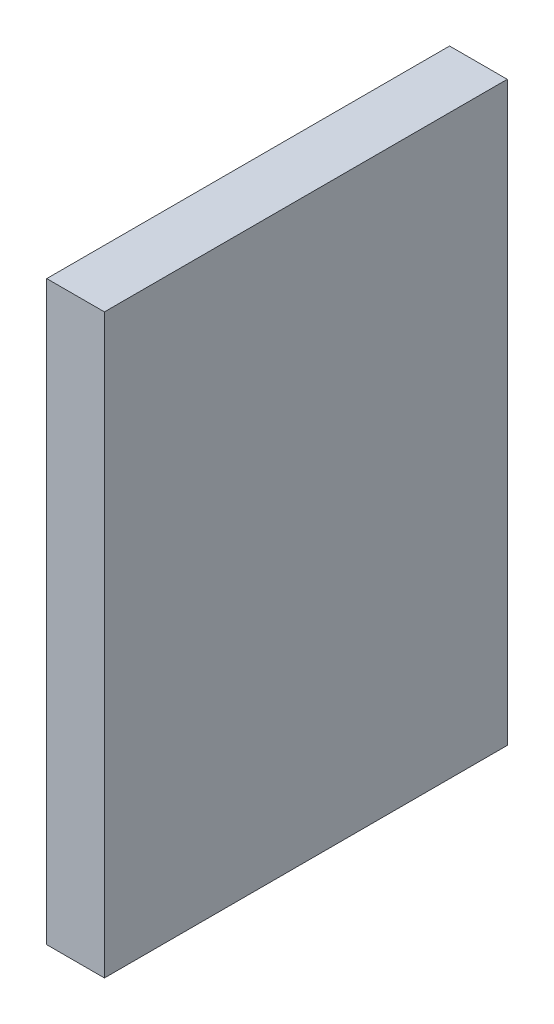
ISO-10303-21;
HEADER;
FILE_DESCRIPTION(('STEP AP214'),'2;1');
FILE_NAME('part.step','',(''),(''),'','','');
FILE_SCHEMA(('AUTOMOTIVE_DESIGN { 1 0 10303 214 1 1 1 1 }'));
ENDSEC;
DATA;
#1=APPLICATION_CONTEXT('core data for automotive mechanical design processes');
#2=APPLICATION_PROTOCOL_DEFINITION('international standard','automotive_design',2000,#1);
#3=PRODUCT_CONTEXT('',#1,'mechanical');
#4=PRODUCT('Part','Part','',(#3));
#5=PRODUCT_RELATED_PRODUCT_CATEGORY('part','',(#4));
#6=PRODUCT_DEFINITION_FORMATION('','',#4);
#7=PRODUCT_DEFINITION_CONTEXT('part definition',#1,'design');
#8=PRODUCT_DEFINITION('design','',#6,#7);
#9=PRODUCT_DEFINITION_SHAPE('','',#8);
#10=(LENGTH_UNIT() NAMED_UNIT(*) SI_UNIT(.MILLI.,.METRE.));
#11=(NAMED_UNIT(*) PLANE_ANGLE_UNIT() SI_UNIT($,.RADIAN.));
#12=(NAMED_UNIT(*) SI_UNIT($,.STERADIAN.) SOLID_ANGLE_UNIT());
#13=UNCERTAINTY_MEASURE_WITH_UNIT(LENGTH_MEASURE(1.E-05),#10,'distance_accuracy_value','');
#14=(GEOMETRIC_REPRESENTATION_CONTEXT(3) GLOBAL_UNCERTAINTY_ASSIGNED_CONTEXT((#13)) GLOBAL_UNIT_ASSIGNED_CONTEXT((#10,
#11,#12)) REPRESENTATION_CONTEXT('',''));
#15=CARTESIAN_POINT('',(0.,0.,0.));
#16=DIRECTION('',(0.,0.,1.));
#17=DIRECTION('',(1.,0.,0.));
#18=AXIS2_PLACEMENT_3D('',#15,#16,#17);
#19=CARTESIAN_POINT('',(3.,0.,0.));
#20=DIRECTION('',(0.,0.,-1.));
#21=DIRECTION('',(-1.,0.,0.));
#22=AXIS2_PLACEMENT_3D('',#19,#20,#21);
#23=PLANE('',#22);
#24=DIRECTION('',(0.,-1.,0.));
#25=VECTOR('',#24,1.);
#26=CARTESIAN_POINT('',(0.,0.,0.));
#27=LINE('',#26,#25);
#28=CARTESIAN_POINT('',(0.,30.,0.));
#29=VERTEX_POINT('',#28);
#30=CARTESIAN_POINT('',(0.,0.,0.));
#31=VERTEX_POINT('',#30);
#32=EDGE_CURVE('E100',#29,#31,#27,.T.);
#33=ORIENTED_EDGE('',*,*,#32,.T.);
#34=DIRECTION('',(-1.,0.,0.));
#35=VECTOR('',#34,1.);
#36=CARTESIAN_POINT('',(3.,0.,0.));
#37=LINE('',#36,#35);
#38=CARTESIAN_POINT('',(3.,0.,0.));
#39=VERTEX_POINT('',#38);
#40=EDGE_CURVE('E11',#39,#31,#37,.T.);
#41=ORIENTED_EDGE('',*,*,#40,.F.);
#42=DIRECTION('',(0.,-1.,0.));
#43=VECTOR('',#42,1.);
#44=CARTESIAN_POINT('',(3.,0.,0.));
#45=LINE('',#44,#43);
#46=CARTESIAN_POINT('',(3.,30.,0.));
#47=VERTEX_POINT('',#46);
#48=EDGE_CURVE('E88',#47,#39,#45,.T.);
#49=ORIENTED_EDGE('',*,*,#48,.F.);
#50=DIRECTION('',(-1.,0.,0.));
#51=VECTOR('',#50,1.);
#52=CARTESIAN_POINT('',(3.,30.,0.));
#53=LINE('',#52,#51);
#54=EDGE_CURVE('E96',#47,#29,#53,.T.);
#55=ORIENTED_EDGE('',*,*,#54,.T.);
#56=EDGE_LOOP('',(#33,#41,#49,#55));
#57=FACE_BOUND('',#56,.T.);
#58=ADVANCED_FACE('F37',(#57),#23,.F.);
#59=CARTESIAN_POINT('',(3.,0.,0.));
#60=DIRECTION('',(0.,1.,0.));
#61=DIRECTION('',(0.,0.,1.));
#62=AXIS2_PLACEMENT_3D('',#59,#60,#61);
#63=PLANE('',#62);
#64=DIRECTION('',(0.,0.,-1.));
#65=VECTOR('',#64,1.);
#66=CARTESIAN_POINT('',(0.,0.,0.));
#67=LINE('',#66,#65);
#68=CARTESIAN_POINT('',(0.,0.,-20.95));
#69=VERTEX_POINT('',#68);
#70=EDGE_CURVE('E92',#31,#69,#67,.T.);
#71=ORIENTED_EDGE('',*,*,#70,.T.);
#72=DIRECTION('',(-1.,0.,0.));
#73=VECTOR('',#72,1.);
#74=CARTESIAN_POINT('',(3.,0.,-20.95));
#75=LINE('',#74,#73);
#76=CARTESIAN_POINT('',(3.,0.,-20.95));
#77=VERTEX_POINT('',#76);
#78=EDGE_CURVE('E45',#77,#69,#75,.T.);
#79=ORIENTED_EDGE('',*,*,#78,.F.);
#80=DIRECTION('',(0.,0.,-1.));
#81=VECTOR('',#80,1.);
#82=CARTESIAN_POINT('',(3.,0.,0.));
#83=LINE('',#82,#81);
#84=EDGE_CURVE('E83',#39,#77,#83,.T.);
#85=ORIENTED_EDGE('',*,*,#84,.F.);
#86=ORIENTED_EDGE('',*,*,#40,.T.);
#87=EDGE_LOOP('',(#71,#79,#85,#86));
#88=FACE_BOUND('',#87,.T.);
#89=ADVANCED_FACE('F91',(#88),#63,.F.);
#90=CARTESIAN_POINT('',(3.,0.,-20.95));
#91=DIRECTION('',(0.,0.,1.));
#92=DIRECTION('',(1.,0.,0.));
#93=AXIS2_PLACEMENT_3D('',#90,#91,#92);
#94=PLANE('',#93);
#95=DIRECTION('',(0.,1.,0.));
#96=VECTOR('',#95,1.);
#97=CARTESIAN_POINT('',(0.,0.,-20.95));
#98=LINE('',#97,#96);
#99=CARTESIAN_POINT('',(0.,30.,-20.95));
#100=VERTEX_POINT('',#99);
#101=EDGE_CURVE('E70',#69,#100,#98,.T.);
#102=ORIENTED_EDGE('',*,*,#101,.T.);
#103=DIRECTION('',(-1.,0.,0.));
#104=VECTOR('',#103,1.);
#105=CARTESIAN_POINT('',(3.,30.,-20.95));
#106=LINE('',#105,#104);
#107=CARTESIAN_POINT('',(3.,30.,-20.95));
#108=VERTEX_POINT('',#107);
#109=EDGE_CURVE('E93',#108,#100,#106,.T.);
#110=ORIENTED_EDGE('',*,*,#109,.F.);
#111=DIRECTION('',(0.,1.,0.));
#112=VECTOR('',#111,1.);
#113=CARTESIAN_POINT('',(3.,0.,-20.95));
#114=LINE('',#113,#112);
#115=EDGE_CURVE('E86',#77,#108,#114,.T.);
#116=ORIENTED_EDGE('',*,*,#115,.F.);
#117=ORIENTED_EDGE('',*,*,#78,.T.);
#118=EDGE_LOOP('',(#102,#110,#116,#117));
#119=FACE_BOUND('',#118,.T.);
#120=ADVANCED_FACE('F94',(#119),#94,.F.);
#121=CARTESIAN_POINT('',(3.,30.,0.));
#122=DIRECTION('',(0.,-1.,0.));
#123=DIRECTION('',(0.,0.,-1.));
#124=AXIS2_PLACEMENT_3D('',#121,#122,#123);
#125=PLANE('',#124);
#126=DIRECTION('',(0.,0.,1.));
#127=VECTOR('',#126,1.);
#128=CARTESIAN_POINT('',(0.,30.,0.));
#129=LINE('',#128,#127);
#130=EDGE_CURVE('E76',#100,#29,#129,.T.);
#131=ORIENTED_EDGE('',*,*,#130,.T.);
#132=ORIENTED_EDGE('',*,*,#54,.F.);
#133=DIRECTION('',(0.,0.,1.));
#134=VECTOR('',#133,1.);
#135=CARTESIAN_POINT('',(3.,30.,0.));
#136=LINE('',#135,#134);
#137=EDGE_CURVE('E53',#108,#47,#136,.T.);
#138=ORIENTED_EDGE('',*,*,#137,.F.);
#139=ORIENTED_EDGE('',*,*,#109,.T.);
#140=EDGE_LOOP('',(#131,#132,#138,#139));
#141=FACE_BOUND('',#140,.T.);
#142=ADVANCED_FACE('F107',(#141),#125,.F.);
#143=CARTESIAN_POINT('',(3.,0.,0.));
#144=DIRECTION('',(-1.,0.,0.));
#145=DIRECTION('',(0.,0.,1.));
#146=AXIS2_PLACEMENT_3D('',#143,#144,#145);
#147=PLANE('',#146);
#148=ORIENTED_EDGE('',*,*,#48,.T.);
#149=ORIENTED_EDGE('',*,*,#84,.T.);
#150=ORIENTED_EDGE('',*,*,#115,.T.);
#151=ORIENTED_EDGE('',*,*,#137,.T.);
#152=EDGE_LOOP('',(#148,#149,#150,#151));
#153=FACE_BOUND('',#152,.T.);
#154=ADVANCED_FACE('F84',(#153),#147,.F.);
#155=CARTESIAN_POINT('',(0.,0.,0.));
#156=DIRECTION('',(-1.,0.,0.));
#157=DIRECTION('',(0.,0.,1.));
#158=AXIS2_PLACEMENT_3D('',#155,#156,#157);
#159=PLANE('',#158);
#160=ORIENTED_EDGE('',*,*,#32,.F.);
#161=ORIENTED_EDGE('',*,*,#130,.F.);
#162=ORIENTED_EDGE('',*,*,#101,.F.);
#163=ORIENTED_EDGE('',*,*,#70,.F.);
#164=EDGE_LOOP('',(#160,#161,#162,#163));
#165=FACE_BOUND('',#164,.T.);
#166=ADVANCED_FACE('F110',(#165),#159,.T.);
#167=CLOSED_SHELL('',(#58,#89,#120,#142,#154,#166));
#168=MANIFOLD_SOLID_BREP('B2',#167);
#169=ADVANCED_BREP_SHAPE_REPRESENTATION('',(#18,#168),#14);
#170=SHAPE_DEFINITION_REPRESENTATION(#9,#169);
ENDSEC;
END-ISO-10303-21;
